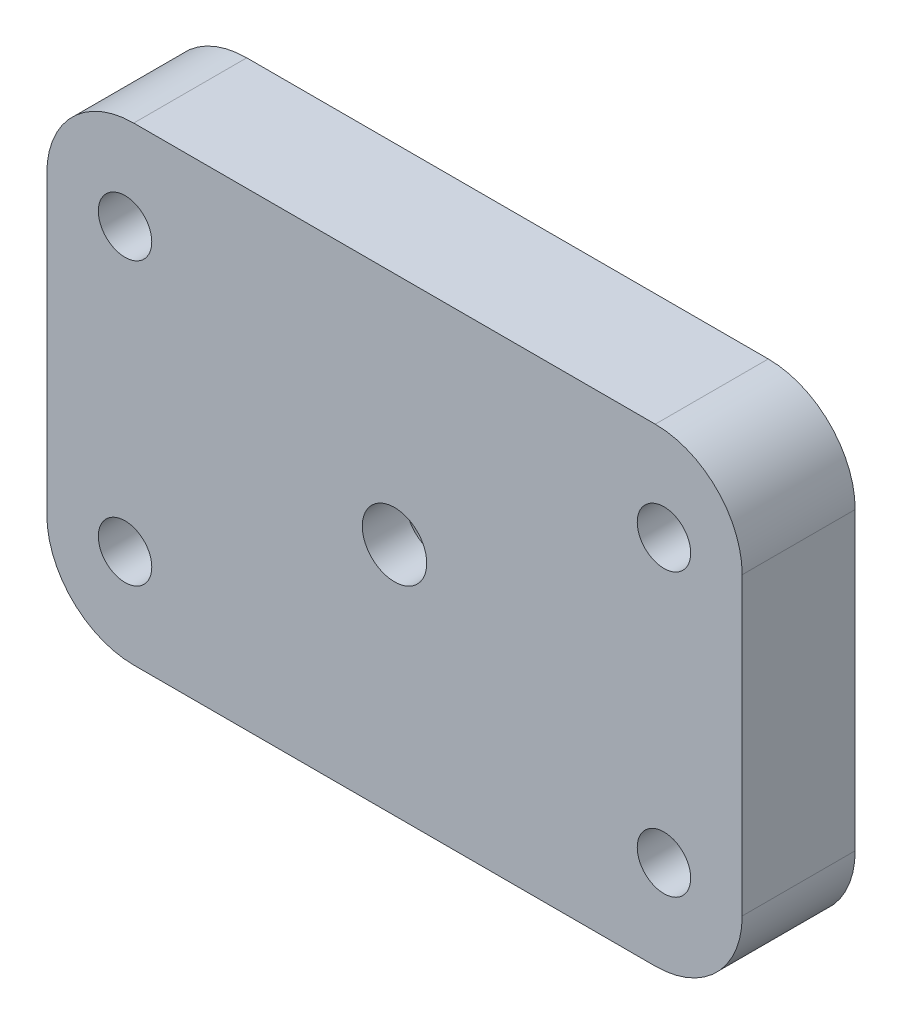
ISO-10303-21;
HEADER;
FILE_DESCRIPTION(('STEP AP214'),'2;1');
FILE_NAME('part.step','',(''),(''),'','','');
FILE_SCHEMA(('AUTOMOTIVE_DESIGN { 1 0 10303 214 1 1 1 1 }'));
ENDSEC;
DATA;
#1=APPLICATION_CONTEXT('core data for automotive mechanical design processes');
#2=APPLICATION_PROTOCOL_DEFINITION('international standard','automotive_design',2000,#1);
#3=PRODUCT_CONTEXT('',#1,'mechanical');
#4=PRODUCT('Part','Part','',(#3));
#5=PRODUCT_RELATED_PRODUCT_CATEGORY('part','',(#4));
#6=PRODUCT_DEFINITION_FORMATION('','',#4);
#7=PRODUCT_DEFINITION_CONTEXT('part definition',#1,'design');
#8=PRODUCT_DEFINITION('design','',#6,#7);
#9=PRODUCT_DEFINITION_SHAPE('','',#8);
#10=(LENGTH_UNIT() NAMED_UNIT(*) SI_UNIT(.MILLI.,.METRE.));
#11=(NAMED_UNIT(*) PLANE_ANGLE_UNIT() SI_UNIT($,.RADIAN.));
#12=(NAMED_UNIT(*) SI_UNIT($,.STERADIAN.) SOLID_ANGLE_UNIT());
#13=UNCERTAINTY_MEASURE_WITH_UNIT(LENGTH_MEASURE(1.E-05),#10,'distance_accuracy_value','');
#14=(GEOMETRIC_REPRESENTATION_CONTEXT(3) GLOBAL_UNCERTAINTY_ASSIGNED_CONTEXT((#13)) GLOBAL_UNIT_ASSIGNED_CONTEXT((#10,
#11,#12)) REPRESENTATION_CONTEXT('',''));
#15=CARTESIAN_POINT('',(0.,0.,0.));
#16=DIRECTION('',(0.,0.,1.));
#17=DIRECTION('',(1.,0.,0.));
#18=AXIS2_PLACEMENT_3D('',#15,#16,#17);
#19=CARTESIAN_POINT('',(0.,189.,39.));
#20=DIRECTION('',(0.,0.,1.));
#21=DIRECTION('',(1.,0.,0.));
#22=AXIS2_PLACEMENT_3D('',#19,#20,#21);
#23=PLANE('',#22);
#24=CARTESIAN_POINT('',(30.0000000000002,206.,39.));
#25=DIRECTION('',(0.,0.,1.));
#26=DIRECTION('',(1.,0.,0.));
#27=AXIS2_PLACEMENT_3D('',#24,#25,#26);
#28=CIRCLE('',#27,10.);
#29=CARTESIAN_POINT('',(30.0000000000002,216.,39.));
#30=VERTEX_POINT('',#29);
#31=CARTESIAN_POINT('',(40.0000000000002,206.,39.));
#32=VERTEX_POINT('',#31);
#33=EDGE_CURVE('E252',#30,#32,#28,.F.);
#34=ORIENTED_EDGE('',*,*,#33,.F.);
#35=DIRECTION('',(1.,0.,0.));
#36=VECTOR('',#35,1.);
#37=CARTESIAN_POINT('',(30.0000000000002,216.,39.));
#38=LINE('',#37,#36);
#39=CARTESIAN_POINT('',(-30.0000000000002,216.,39.));
#40=VERTEX_POINT('',#39);
#41=EDGE_CURVE('E249',#40,#30,#38,.T.);
#42=ORIENTED_EDGE('',*,*,#41,.F.);
#43=CARTESIAN_POINT('',(-30.0000000000002,206.,39.));
#44=DIRECTION('',(0.,0.,1.));
#45=DIRECTION('',(1.,0.,0.));
#46=AXIS2_PLACEMENT_3D('',#43,#44,#45);
#47=CIRCLE('',#46,10.);
#48=CARTESIAN_POINT('',(-40.0000000000002,206.,39.));
#49=VERTEX_POINT('',#48);
#50=EDGE_CURVE('E243',#49,#40,#47,.F.);
#51=ORIENTED_EDGE('',*,*,#50,.F.);
#52=DIRECTION('',(0.,1.,0.));
#53=VECTOR('',#52,1.);
#54=CARTESIAN_POINT('',(-40.0000000000002,206.,39.));
#55=LINE('',#54,#53);
#56=CARTESIAN_POINT('',(-40.0000000000002,172.,39.));
#57=VERTEX_POINT('',#56);
#58=EDGE_CURVE('E225',#57,#49,#55,.T.);
#59=ORIENTED_EDGE('',*,*,#58,.F.);
#60=CARTESIAN_POINT('',(-30.0000000000002,172.,39.));
#61=DIRECTION('',(0.,0.,1.));
#62=DIRECTION('',(1.,0.,0.));
#63=AXIS2_PLACEMENT_3D('',#60,#61,#62);
#64=CIRCLE('',#63,10.);
#65=CARTESIAN_POINT('',(-30.0000000000002,162.,39.));
#66=VERTEX_POINT('',#65);
#67=EDGE_CURVE('E109',#66,#57,#64,.F.);
#68=ORIENTED_EDGE('',*,*,#67,.F.);
#69=DIRECTION('',(1.,0.,0.));
#70=VECTOR('',#69,1.);
#71=CARTESIAN_POINT('',(-30.0000000000002,162.,39.));
#72=LINE('',#71,#70);
#73=CARTESIAN_POINT('',(30.0000000000002,162.,39.));
#74=VERTEX_POINT('',#73);
#75=EDGE_CURVE('E261',#74,#66,#72,.F.);
#76=ORIENTED_EDGE('',*,*,#75,.F.);
#77=CARTESIAN_POINT('',(30.0000000000002,172.,39.));
#78=DIRECTION('',(0.,0.,1.));
#79=DIRECTION('',(1.,0.,0.));
#80=AXIS2_PLACEMENT_3D('',#77,#78,#79);
#81=CIRCLE('',#80,10.);
#82=CARTESIAN_POINT('',(40.0000000000002,172.,39.));
#83=VERTEX_POINT('',#82);
#84=EDGE_CURVE('E258',#83,#74,#81,.F.);
#85=ORIENTED_EDGE('',*,*,#84,.F.);
#86=DIRECTION('',(0.,1.,0.));
#87=VECTOR('',#86,1.);
#88=CARTESIAN_POINT('',(40.0000000000002,172.,39.));
#89=LINE('',#88,#87);
#90=EDGE_CURVE('E255',#32,#83,#89,.F.);
#91=ORIENTED_EDGE('',*,*,#90,.F.);
#92=EDGE_LOOP('',(#34,#42,#51,#59,#68,#76,#85,#91));
#93=FACE_BOUND('',#92,.T.);
#94=CARTESIAN_POINT('',(0.,189.,39.));
#95=DIRECTION('',(0.,0.,1.));
#96=DIRECTION('',(1.,0.,0.));
#97=AXIS2_PLACEMENT_3D('',#94,#95,#96);
#98=CIRCLE('',#97,3.706733851603);
#99=CARTESIAN_POINT('',(3.70673385160301,189.,39.));
#100=VERTEX_POINT('',#99);
#101=EDGE_CURVE('E222',#100,#100,#98,.T.);
#102=ORIENTED_EDGE('',*,*,#101,.F.);
#103=EDGE_LOOP('',(#102));
#104=FACE_BOUND('',#103,.T.);
#105=CARTESIAN_POINT('',(30.9999999999999,172.8,39.));
#106=DIRECTION('',(0.,0.,1.));
#107=DIRECTION('',(1.,0.,0.));
#108=AXIS2_PLACEMENT_3D('',#105,#106,#107);
#109=CIRCLE('',#108,3.07500000000001);
#110=CARTESIAN_POINT('',(34.0749999999999,172.8,39.));
#111=VERTEX_POINT('',#110);
#112=EDGE_CURVE('E194',#111,#111,#109,.T.);
#113=ORIENTED_EDGE('',*,*,#112,.F.);
#114=EDGE_LOOP('',(#113));
#115=FACE_BOUND('',#114,.T.);
#116=CARTESIAN_POINT('',(30.9999999999998,205.2,39.));
#117=DIRECTION('',(0.,0.,1.));
#118=DIRECTION('',(1.,0.,0.));
#119=AXIS2_PLACEMENT_3D('',#116,#117,#118);
#120=CIRCLE('',#119,3.07500000000002);
#121=CARTESIAN_POINT('',(34.0749999999998,205.2,39.));
#122=VERTEX_POINT('',#121);
#123=EDGE_CURVE('E365',#122,#122,#120,.T.);
#124=ORIENTED_EDGE('',*,*,#123,.F.);
#125=EDGE_LOOP('',(#124));
#126=FACE_BOUND('',#125,.T.);
#127=CARTESIAN_POINT('',(-31.0000000000002,205.2,39.));
#128=DIRECTION('',(0.,0.,1.));
#129=DIRECTION('',(1.,0.,0.));
#130=AXIS2_PLACEMENT_3D('',#127,#128,#129);
#131=CIRCLE('',#130,3.07500000000001);
#132=CARTESIAN_POINT('',(-27.9250000000002,205.2,39.));
#133=VERTEX_POINT('',#132);
#134=EDGE_CURVE('E363',#133,#133,#131,.T.);
#135=ORIENTED_EDGE('',*,*,#134,.F.);
#136=EDGE_LOOP('',(#135));
#137=FACE_BOUND('',#136,.T.);
#138=CARTESIAN_POINT('',(-31.0000000000001,172.8,39.));
#139=DIRECTION('',(0.,0.,1.));
#140=DIRECTION('',(1.,0.,0.));
#141=AXIS2_PLACEMENT_3D('',#138,#139,#140);
#142=CIRCLE('',#141,3.07500000000001);
#143=CARTESIAN_POINT('',(-27.9250000000001,172.8,39.));
#144=VERTEX_POINT('',#143);
#145=EDGE_CURVE('E366',#144,#144,#142,.T.);
#146=ORIENTED_EDGE('',*,*,#145,.F.);
#147=EDGE_LOOP('',(#146));
#148=FACE_BOUND('',#147,.T.);
#149=ADVANCED_FACE('F33',(#93,#104,#115,#126,#137,#148),#23,.T.);
#150=CARTESIAN_POINT('',(-40.0000000000002,206.,26.));
#151=DIRECTION('',(-1.,0.,0.));
#152=DIRECTION('',(0.,0.,1.));
#153=AXIS2_PLACEMENT_3D('',#150,#151,#152);
#154=PLANE('',#153);
#155=ORIENTED_EDGE('',*,*,#58,.T.);
#156=DIRECTION('',(0.,0.,1.));
#157=VECTOR('',#156,1.);
#158=CARTESIAN_POINT('',(-40.0000000000002,206.,26.));
#159=LINE('',#158,#157);
#160=CARTESIAN_POINT('',(-40.0000000000002,206.,26.));
#161=VERTEX_POINT('',#160);
#162=EDGE_CURVE('E244',#161,#49,#159,.T.);
#163=ORIENTED_EDGE('',*,*,#162,.F.);
#164=DIRECTION('',(0.,1.,0.));
#165=VECTOR('',#164,1.);
#166=CARTESIAN_POINT('',(-40.0000000000002,189.,26.));
#167=LINE('',#166,#165);
#168=CARTESIAN_POINT('',(-40.0000000000002,172.,26.));
#169=VERTEX_POINT('',#168);
#170=EDGE_CURVE('E239',#161,#169,#167,.F.);
#171=ORIENTED_EDGE('',*,*,#170,.T.);
#172=DIRECTION('',(0.,0.,1.));
#173=VECTOR('',#172,1.);
#174=CARTESIAN_POINT('',(-40.0000000000002,172.,26.));
#175=LINE('',#174,#173);
#176=EDGE_CURVE('E262',#57,#169,#175,.F.);
#177=ORIENTED_EDGE('',*,*,#176,.F.);
#178=EDGE_LOOP('',(#155,#163,#171,#177));
#179=FACE_BOUND('',#178,.T.);
#180=ADVANCED_FACE('F307',(#179),#154,.T.);
#181=CARTESIAN_POINT('',(-30.0000000000002,172.,26.));
#182=DIRECTION('',(0.,0.,1.));
#183=DIRECTION('',(1.,0.,0.));
#184=AXIS2_PLACEMENT_3D('',#181,#182,#183);
#185=CYLINDRICAL_SURFACE('',#184,10.);
#186=ORIENTED_EDGE('',*,*,#67,.T.);
#187=ORIENTED_EDGE('',*,*,#176,.T.);
#188=CARTESIAN_POINT('',(-30.0000000000002,172.,26.));
#189=DIRECTION('',(0.,0.,1.));
#190=DIRECTION('',(1.,0.,0.));
#191=AXIS2_PLACEMENT_3D('',#188,#189,#190);
#192=CIRCLE('',#191,10.);
#193=CARTESIAN_POINT('',(-30.0000000000002,162.,26.));
#194=VERTEX_POINT('',#193);
#195=EDGE_CURVE('E238',#169,#194,#192,.T.);
#196=ORIENTED_EDGE('',*,*,#195,.T.);
#197=DIRECTION('',(0.,0.,-1.));
#198=VECTOR('',#197,1.);
#199=CARTESIAN_POINT('',(-30.0000000000002,162.,26.));
#200=LINE('',#199,#198);
#201=EDGE_CURVE('E259',#66,#194,#200,.T.);
#202=ORIENTED_EDGE('',*,*,#201,.F.);
#203=EDGE_LOOP('',(#186,#187,#196,#202));
#204=FACE_BOUND('',#203,.T.);
#205=ADVANCED_FACE('F304',(#204),#185,.T.);
#206=CARTESIAN_POINT('',(-30.0000000000002,162.,26.));
#207=DIRECTION('',(0.,-1.,0.));
#208=DIRECTION('',(0.,0.,-1.));
#209=AXIS2_PLACEMENT_3D('',#206,#207,#208);
#210=PLANE('',#209);
#211=ORIENTED_EDGE('',*,*,#75,.T.);
#212=ORIENTED_EDGE('',*,*,#201,.T.);
#213=DIRECTION('',(1.,0.,0.));
#214=VECTOR('',#213,1.);
#215=CARTESIAN_POINT('',(0.,162.,26.));
#216=LINE('',#215,#214);
#217=CARTESIAN_POINT('',(30.0000000000002,162.,26.));
#218=VERTEX_POINT('',#217);
#219=EDGE_CURVE('E235',#194,#218,#216,.T.);
#220=ORIENTED_EDGE('',*,*,#219,.T.);
#221=DIRECTION('',(0.,0.,1.));
#222=VECTOR('',#221,1.);
#223=CARTESIAN_POINT('',(30.0000000000002,162.,26.));
#224=LINE('',#223,#222);
#225=EDGE_CURVE('E256',#74,#218,#224,.F.);
#226=ORIENTED_EDGE('',*,*,#225,.F.);
#227=EDGE_LOOP('',(#211,#212,#220,#226));
#228=FACE_BOUND('',#227,.T.);
#229=ADVANCED_FACE('F297',(#228),#210,.T.);
#230=CARTESIAN_POINT('',(30.0000000000002,172.,26.));
#231=DIRECTION('',(0.,0.,1.));
#232=DIRECTION('',(1.,0.,0.));
#233=AXIS2_PLACEMENT_3D('',#230,#231,#232);
#234=CYLINDRICAL_SURFACE('',#233,10.);
#235=ORIENTED_EDGE('',*,*,#84,.T.);
#236=ORIENTED_EDGE('',*,*,#225,.T.);
#237=CARTESIAN_POINT('',(30.0000000000002,172.,26.));
#238=DIRECTION('',(0.,0.,1.));
#239=DIRECTION('',(1.,0.,0.));
#240=AXIS2_PLACEMENT_3D('',#237,#238,#239);
#241=CIRCLE('',#240,10.);
#242=CARTESIAN_POINT('',(40.0000000000002,172.,26.));
#243=VERTEX_POINT('',#242);
#244=EDGE_CURVE('E234',#218,#243,#241,.T.);
#245=ORIENTED_EDGE('',*,*,#244,.T.);
#246=DIRECTION('',(0.,0.,-1.));
#247=VECTOR('',#246,1.);
#248=CARTESIAN_POINT('',(40.0000000000002,172.,26.));
#249=LINE('',#248,#247);
#250=EDGE_CURVE('E253',#83,#243,#249,.T.);
#251=ORIENTED_EDGE('',*,*,#250,.F.);
#252=EDGE_LOOP('',(#235,#236,#245,#251));
#253=FACE_BOUND('',#252,.T.);
#254=ADVANCED_FACE('F289',(#253),#234,.T.);
#255=CARTESIAN_POINT('',(40.0000000000002,172.,26.));
#256=DIRECTION('',(1.,0.,0.));
#257=DIRECTION('',(0.,0.,-1.));
#258=AXIS2_PLACEMENT_3D('',#255,#256,#257);
#259=PLANE('',#258);
#260=ORIENTED_EDGE('',*,*,#90,.T.);
#261=ORIENTED_EDGE('',*,*,#250,.T.);
#262=DIRECTION('',(0.,1.,0.));
#263=VECTOR('',#262,1.);
#264=CARTESIAN_POINT('',(40.0000000000002,189.,26.));
#265=LINE('',#264,#263);
#266=CARTESIAN_POINT('',(40.0000000000002,206.,26.));
#267=VERTEX_POINT('',#266);
#268=EDGE_CURVE('E231',#243,#267,#265,.T.);
#269=ORIENTED_EDGE('',*,*,#268,.T.);
#270=DIRECTION('',(0.,0.,1.));
#271=VECTOR('',#270,1.);
#272=CARTESIAN_POINT('',(40.0000000000002,206.,26.));
#273=LINE('',#272,#271);
#274=EDGE_CURVE('E250',#32,#267,#273,.F.);
#275=ORIENTED_EDGE('',*,*,#274,.F.);
#276=EDGE_LOOP('',(#260,#261,#269,#275));
#277=FACE_BOUND('',#276,.T.);
#278=ADVANCED_FACE('F318',(#277),#259,.T.);
#279=CARTESIAN_POINT('',(30.0000000000002,206.,26.));
#280=DIRECTION('',(0.,0.,1.));
#281=DIRECTION('',(1.,0.,0.));
#282=AXIS2_PLACEMENT_3D('',#279,#280,#281);
#283=CYLINDRICAL_SURFACE('',#282,10.);
#284=ORIENTED_EDGE('',*,*,#33,.T.);
#285=ORIENTED_EDGE('',*,*,#274,.T.);
#286=CARTESIAN_POINT('',(30.0000000000002,206.,26.));
#287=DIRECTION('',(0.,0.,1.));
#288=DIRECTION('',(1.,0.,0.));
#289=AXIS2_PLACEMENT_3D('',#286,#287,#288);
#290=CIRCLE('',#289,10.);
#291=CARTESIAN_POINT('',(30.0000000000002,216.,26.));
#292=VERTEX_POINT('',#291);
#293=EDGE_CURVE('E230',#267,#292,#290,.T.);
#294=ORIENTED_EDGE('',*,*,#293,.T.);
#295=DIRECTION('',(0.,0.,1.));
#296=VECTOR('',#295,1.);
#297=CARTESIAN_POINT('',(30.0000000000002,216.,26.));
#298=LINE('',#297,#296);
#299=EDGE_CURVE('E247',#30,#292,#298,.F.);
#300=ORIENTED_EDGE('',*,*,#299,.F.);
#301=EDGE_LOOP('',(#284,#285,#294,#300));
#302=FACE_BOUND('',#301,.T.);
#303=ADVANCED_FACE('F315',(#302),#283,.T.);
#304=CARTESIAN_POINT('',(30.0000000000002,216.,26.));
#305=DIRECTION('',(0.,1.,0.));
#306=DIRECTION('',(0.,0.,1.));
#307=AXIS2_PLACEMENT_3D('',#304,#305,#306);
#308=PLANE('',#307);
#309=ORIENTED_EDGE('',*,*,#41,.T.);
#310=ORIENTED_EDGE('',*,*,#299,.T.);
#311=DIRECTION('',(1.,0.,0.));
#312=VECTOR('',#311,1.);
#313=CARTESIAN_POINT('',(0.,216.,26.));
#314=LINE('',#313,#312);
#315=CARTESIAN_POINT('',(-30.0000000000002,216.,26.));
#316=VERTEX_POINT('',#315);
#317=EDGE_CURVE('E226',#292,#316,#314,.F.);
#318=ORIENTED_EDGE('',*,*,#317,.T.);
#319=DIRECTION('',(0.,0.,1.));
#320=VECTOR('',#319,1.);
#321=CARTESIAN_POINT('',(-30.0000000000002,216.,26.));
#322=LINE('',#321,#320);
#323=EDGE_CURVE('E58',#40,#316,#322,.F.);
#324=ORIENTED_EDGE('',*,*,#323,.F.);
#325=EDGE_LOOP('',(#309,#310,#318,#324));
#326=FACE_BOUND('',#325,.T.);
#327=ADVANCED_FACE('F311',(#326),#308,.T.);
#328=CARTESIAN_POINT('',(-30.0000000000002,206.,26.));
#329=DIRECTION('',(0.,0.,1.));
#330=DIRECTION('',(1.,0.,0.));
#331=AXIS2_PLACEMENT_3D('',#328,#329,#330);
#332=CYLINDRICAL_SURFACE('',#331,10.);
#333=ORIENTED_EDGE('',*,*,#50,.T.);
#334=ORIENTED_EDGE('',*,*,#323,.T.);
#335=CARTESIAN_POINT('',(-30.0000000000002,206.,26.));
#336=DIRECTION('',(0.,0.,1.));
#337=DIRECTION('',(1.,0.,0.));
#338=AXIS2_PLACEMENT_3D('',#335,#336,#337);
#339=CIRCLE('',#338,10.);
#340=EDGE_CURVE('E229',#316,#161,#339,.T.);
#341=ORIENTED_EDGE('',*,*,#340,.T.);
#342=ORIENTED_EDGE('',*,*,#162,.T.);
#343=EDGE_LOOP('',(#333,#334,#341,#342));
#344=FACE_BOUND('',#343,.T.);
#345=ADVANCED_FACE('F320',(#344),#332,.T.);
#346=CARTESIAN_POINT('',(30.9999999999999,172.8,17.55));
#347=DIRECTION('',(0.,0.,-1.));
#348=DIRECTION('',(-1.,0.,0.));
#349=AXIS2_PLACEMENT_3D('',#346,#347,#348);
#350=CYLINDRICAL_SURFACE('',#349,3.075);
#351=CARTESIAN_POINT('',(30.9999999999999,172.8,26.));
#352=DIRECTION('',(0.,0.,-1.));
#353=DIRECTION('',(-1.,0.,0.));
#354=AXIS2_PLACEMENT_3D('',#351,#352,#353);
#355=CIRCLE('',#354,3.075);
#356=CARTESIAN_POINT('',(27.9249999999999,172.8,26.));
#357=VERTEX_POINT('',#356);
#358=EDGE_CURVE('E273',#357,#357,#355,.T.);
#359=ORIENTED_EDGE('',*,*,#358,.T.);
#360=EDGE_LOOP('',(#359));
#361=FACE_BOUND('',#360,.T.);
#362=ORIENTED_EDGE('',*,*,#112,.T.);
#363=EDGE_LOOP('',(#362));
#364=FACE_BOUND('',#363,.T.);
#365=ADVANCED_FACE('F322',(#361,#364),#350,.F.);
#366=CARTESIAN_POINT('',(-31.0000000000002,205.2,17.55));
#367=DIRECTION('',(0.,0.,-1.));
#368=DIRECTION('',(-1.,0.,0.));
#369=AXIS2_PLACEMENT_3D('',#366,#367,#368);
#370=CYLINDRICAL_SURFACE('',#369,3.075);
#371=CARTESIAN_POINT('',(-31.0000000000002,205.2,26.));
#372=DIRECTION('',(0.,0.,-1.));
#373=DIRECTION('',(-1.,0.,0.));
#374=AXIS2_PLACEMENT_3D('',#371,#372,#373);
#375=CIRCLE('',#374,3.075);
#376=CARTESIAN_POINT('',(-34.0750000000002,205.2,26.));
#377=VERTEX_POINT('',#376);
#378=EDGE_CURVE('E270',#377,#377,#375,.T.);
#379=ORIENTED_EDGE('',*,*,#378,.T.);
#380=EDGE_LOOP('',(#379));
#381=FACE_BOUND('',#380,.T.);
#382=ORIENTED_EDGE('',*,*,#134,.T.);
#383=EDGE_LOOP('',(#382));
#384=FACE_BOUND('',#383,.T.);
#385=ADVANCED_FACE('F329',(#381,#384),#370,.F.);
#386=CARTESIAN_POINT('',(-31.0000000000001,172.8,17.55));
#387=DIRECTION('',(0.,0.,-1.));
#388=DIRECTION('',(-1.,0.,0.));
#389=AXIS2_PLACEMENT_3D('',#386,#387,#388);
#390=CYLINDRICAL_SURFACE('',#389,3.075);
#391=CARTESIAN_POINT('',(-31.0000000000001,172.8,26.));
#392=DIRECTION('',(0.,0.,-1.));
#393=DIRECTION('',(-1.,0.,0.));
#394=AXIS2_PLACEMENT_3D('',#391,#392,#393);
#395=CIRCLE('',#394,3.075);
#396=CARTESIAN_POINT('',(-34.0750000000001,172.8,26.));
#397=VERTEX_POINT('',#396);
#398=EDGE_CURVE('E41',#397,#397,#395,.T.);
#399=ORIENTED_EDGE('',*,*,#398,.T.);
#400=EDGE_LOOP('',(#399));
#401=FACE_BOUND('',#400,.T.);
#402=ORIENTED_EDGE('',*,*,#145,.T.);
#403=EDGE_LOOP('',(#402));
#404=FACE_BOUND('',#403,.T.);
#405=ADVANCED_FACE('F345',(#401,#404),#390,.F.);
#406=CARTESIAN_POINT('',(30.9999999999998,205.2,17.55));
#407=DIRECTION('',(0.,0.,-1.));
#408=DIRECTION('',(-1.,0.,0.));
#409=AXIS2_PLACEMENT_3D('',#406,#407,#408);
#410=CYLINDRICAL_SURFACE('',#409,3.075);
#411=CARTESIAN_POINT('',(30.9999999999998,205.2,26.));
#412=DIRECTION('',(0.,0.,-1.));
#413=DIRECTION('',(-1.,0.,0.));
#414=AXIS2_PLACEMENT_3D('',#411,#412,#413);
#415=CIRCLE('',#414,3.075);
#416=CARTESIAN_POINT('',(27.9249999999998,205.2,26.));
#417=VERTEX_POINT('',#416);
#418=EDGE_CURVE('E11',#417,#417,#415,.T.);
#419=ORIENTED_EDGE('',*,*,#418,.T.);
#420=EDGE_LOOP('',(#419));
#421=FACE_BOUND('',#420,.T.);
#422=ORIENTED_EDGE('',*,*,#123,.T.);
#423=EDGE_LOOP('',(#422));
#424=FACE_BOUND('',#423,.T.);
#425=ADVANCED_FACE('F335',(#421,#424),#410,.F.);
#426=CARTESIAN_POINT('',(0.,189.,26.));
#427=DIRECTION('',(0.,0.,1.));
#428=DIRECTION('',(1.,0.,0.));
#429=AXIS2_PLACEMENT_3D('',#426,#427,#428);
#430=PLANE('',#429);
#431=DIRECTION('',(-1.,0.,0.));
#432=VECTOR('',#431,1.);
#433=CARTESIAN_POINT('',(-3.99999999999996,180.75,26.));
#434=LINE('',#433,#432);
#435=CARTESIAN_POINT('',(4.,180.75,26.));
#436=VERTEX_POINT('',#435);
#437=CARTESIAN_POINT('',(-3.99999999999996,180.75,26.));
#438=VERTEX_POINT('',#437);
#439=EDGE_CURVE('E193',#436,#438,#434,.T.);
#440=ORIENTED_EDGE('',*,*,#439,.F.);
#441=CARTESIAN_POINT('',(4.00000000000002,183.75,26.));
#442=DIRECTION('',(0.,0.,-1.));
#443=DIRECTION('',(1.,0.,0.));
#444=AXIS2_PLACEMENT_3D('',#441,#442,#443);
#445=CIRCLE('',#444,3.);
#446=CARTESIAN_POINT('',(7.00000000000002,183.75,26.));
#447=VERTEX_POINT('',#446);
#448=EDGE_CURVE('E49',#447,#436,#445,.T.);
#449=ORIENTED_EDGE('',*,*,#448,.F.);
#450=DIRECTION('',(0.,-1.,0.));
#451=VECTOR('',#450,1.);
#452=CARTESIAN_POINT('',(7.00000000000002,183.75,26.));
#453=LINE('',#452,#451);
#454=CARTESIAN_POINT('',(7.00000000000002,194.25,26.));
#455=VERTEX_POINT('',#454);
#456=EDGE_CURVE('E209',#455,#447,#453,.T.);
#457=ORIENTED_EDGE('',*,*,#456,.F.);
#458=CARTESIAN_POINT('',(4.00000000000002,194.25,26.));
#459=DIRECTION('',(0.,0.,-1.));
#460=DIRECTION('',(-1.,0.,0.));
#461=AXIS2_PLACEMENT_3D('',#458,#459,#460);
#462=CIRCLE('',#461,3.);
#463=CARTESIAN_POINT('',(4.,197.25,26.));
#464=VERTEX_POINT('',#463);
#465=EDGE_CURVE('E207',#464,#455,#462,.T.);
#466=ORIENTED_EDGE('',*,*,#465,.F.);
#467=DIRECTION('',(1.,0.,0.));
#468=VECTOR('',#467,1.);
#469=CARTESIAN_POINT('',(-3.99999999999996,197.25,26.));
#470=LINE('',#469,#468);
#471=CARTESIAN_POINT('',(-3.99999999999996,197.25,26.));
#472=VERTEX_POINT('',#471);
#473=EDGE_CURVE('E169',#472,#464,#470,.T.);
#474=ORIENTED_EDGE('',*,*,#473,.F.);
#475=CARTESIAN_POINT('',(-3.99999999999998,194.25,26.));
#476=DIRECTION('',(0.,0.,-1.));
#477=DIRECTION('',(-1.,0.,0.));
#478=AXIS2_PLACEMENT_3D('',#475,#476,#477);
#479=CIRCLE('',#478,3.);
#480=CARTESIAN_POINT('',(-6.99999999999998,194.25,26.));
#481=VERTEX_POINT('',#480);
#482=EDGE_CURVE('E203',#481,#472,#479,.T.);
#483=ORIENTED_EDGE('',*,*,#482,.F.);
#484=DIRECTION('',(0.,1.,0.));
#485=VECTOR('',#484,1.);
#486=CARTESIAN_POINT('',(-6.99999999999998,183.75,26.));
#487=LINE('',#486,#485);
#488=CARTESIAN_POINT('',(-6.99999999999998,183.75,26.));
#489=VERTEX_POINT('',#488);
#490=EDGE_CURVE('E200',#489,#481,#487,.T.);
#491=ORIENTED_EDGE('',*,*,#490,.F.);
#492=CARTESIAN_POINT('',(-3.99999999999998,183.75,26.));
#493=DIRECTION('',(0.,0.,-1.));
#494=DIRECTION('',(-1.,0.,0.));
#495=AXIS2_PLACEMENT_3D('',#492,#493,#494);
#496=CIRCLE('',#495,3.);
#497=EDGE_CURVE('E197',#438,#489,#496,.T.);
#498=ORIENTED_EDGE('',*,*,#497,.F.);
#499=EDGE_LOOP('',(#440,#449,#457,#466,#474,#483,#491,#498));
#500=FACE_BOUND('',#499,.T.);
#501=ORIENTED_EDGE('',*,*,#418,.F.);
#502=EDGE_LOOP('',(#501));
#503=FACE_BOUND('',#502,.T.);
#504=ORIENTED_EDGE('',*,*,#398,.F.);
#505=EDGE_LOOP('',(#504));
#506=FACE_BOUND('',#505,.T.);
#507=ORIENTED_EDGE('',*,*,#378,.F.);
#508=EDGE_LOOP('',(#507));
#509=FACE_BOUND('',#508,.T.);
#510=ORIENTED_EDGE('',*,*,#358,.F.);
#511=EDGE_LOOP('',(#510));
#512=FACE_BOUND('',#511,.T.);
#513=ORIENTED_EDGE('',*,*,#317,.F.);
#514=ORIENTED_EDGE('',*,*,#293,.F.);
#515=ORIENTED_EDGE('',*,*,#268,.F.);
#516=ORIENTED_EDGE('',*,*,#244,.F.);
#517=ORIENTED_EDGE('',*,*,#219,.F.);
#518=ORIENTED_EDGE('',*,*,#195,.F.);
#519=ORIENTED_EDGE('',*,*,#170,.F.);
#520=ORIENTED_EDGE('',*,*,#340,.F.);
#521=EDGE_LOOP('',(#513,#514,#515,#516,#517,#518,#519,#520));
#522=FACE_BOUND('',#521,.T.);
#523=ADVANCED_FACE('F302',(#500,#503,#506,#509,#512,#522),#430,.F.);
#524=CARTESIAN_POINT('',(0.,189.,111.124891681028));
#525=DIRECTION('',(0.,0.,-1.));
#526=DIRECTION('',(-1.,0.,0.));
#527=AXIS2_PLACEMENT_3D('',#524,#525,#526);
#528=CYLINDRICAL_SURFACE('',#527,3.706733851603);
#529=CARTESIAN_POINT('',(0.,189.,34.));
#530=DIRECTION('',(0.,0.,1.));
#531=DIRECTION('',(1.,0.,0.));
#532=AXIS2_PLACEMENT_3D('',#529,#530,#531);
#533=CIRCLE('',#532,3.706733851603);
#534=CARTESIAN_POINT('',(3.70673385160301,189.,34.));
#535=VERTEX_POINT('',#534);
#536=EDGE_CURVE('E36',#535,#535,#533,.T.);
#537=ORIENTED_EDGE('',*,*,#536,.F.);
#538=EDGE_LOOP('',(#537));
#539=FACE_BOUND('',#538,.T.);
#540=ORIENTED_EDGE('',*,*,#101,.T.);
#541=EDGE_LOOP('',(#540));
#542=FACE_BOUND('',#541,.T.);
#543=ADVANCED_FACE('F334',(#539,#542),#528,.F.);
#544=CARTESIAN_POINT('',(4.00000000000002,183.75,34.));
#545=DIRECTION('',(0.,0.,-1.));
#546=DIRECTION('',(-1.,0.,0.));
#547=AXIS2_PLACEMENT_3D('',#544,#545,#546);
#548=CYLINDRICAL_SURFACE('',#547,3.);
#549=ORIENTED_EDGE('',*,*,#448,.T.);
#550=DIRECTION('',(0.,0.,-1.));
#551=VECTOR('',#550,1.);
#552=CARTESIAN_POINT('',(4.,180.75,34.));
#553=LINE('',#552,#551);
#554=CARTESIAN_POINT('',(4.,180.75,34.));
#555=VERTEX_POINT('',#554);
#556=EDGE_CURVE('E145',#555,#436,#553,.T.);
#557=ORIENTED_EDGE('',*,*,#556,.F.);
#558=CARTESIAN_POINT('',(4.00000000000002,183.75,34.));
#559=DIRECTION('',(0.,0.,-1.));
#560=DIRECTION('',(1.,0.,0.));
#561=AXIS2_PLACEMENT_3D('',#558,#559,#560);
#562=CIRCLE('',#561,3.);
#563=CARTESIAN_POINT('',(7.00000000000002,183.75,34.));
#564=VERTEX_POINT('',#563);
#565=EDGE_CURVE('E211',#564,#555,#562,.T.);
#566=ORIENTED_EDGE('',*,*,#565,.F.);
#567=DIRECTION('',(0.,0.,-1.));
#568=VECTOR('',#567,1.);
#569=CARTESIAN_POINT('',(7.00000000000002,183.75,34.));
#570=LINE('',#569,#568);
#571=EDGE_CURVE('E117',#564,#447,#570,.T.);
#572=ORIENTED_EDGE('',*,*,#571,.T.);
#573=EDGE_LOOP('',(#549,#557,#566,#572));
#574=FACE_BOUND('',#573,.T.);
#575=ADVANCED_FACE('F341',(#574),#548,.F.);
#576=CARTESIAN_POINT('',(7.00000000000002,183.75,34.));
#577=DIRECTION('',(1.,0.,0.));
#578=DIRECTION('',(0.,0.,-1.));
#579=AXIS2_PLACEMENT_3D('',#576,#577,#578);
#580=PLANE('',#579);
#581=ORIENTED_EDGE('',*,*,#456,.T.);
#582=ORIENTED_EDGE('',*,*,#571,.F.);
#583=DIRECTION('',(0.,-1.,0.));
#584=VECTOR('',#583,1.);
#585=CARTESIAN_POINT('',(7.00000000000002,183.75,34.));
#586=LINE('',#585,#584);
#587=CARTESIAN_POINT('',(7.00000000000002,194.25,34.));
#588=VERTEX_POINT('',#587);
#589=EDGE_CURVE('E179',#588,#564,#586,.T.);
#590=ORIENTED_EDGE('',*,*,#589,.F.);
#591=DIRECTION('',(0.,0.,-1.));
#592=VECTOR('',#591,1.);
#593=CARTESIAN_POINT('',(7.00000000000002,194.25,34.));
#594=LINE('',#593,#592);
#595=EDGE_CURVE('E140',#588,#455,#594,.T.);
#596=ORIENTED_EDGE('',*,*,#595,.T.);
#597=EDGE_LOOP('',(#581,#582,#590,#596));
#598=FACE_BOUND('',#597,.T.);
#599=ADVANCED_FACE('F390',(#598),#580,.F.);
#600=CARTESIAN_POINT('',(4.00000000000002,194.25,34.));
#601=DIRECTION('',(0.,0.,-1.));
#602=DIRECTION('',(-1.,0.,0.));
#603=AXIS2_PLACEMENT_3D('',#600,#601,#602);
#604=CYLINDRICAL_SURFACE('',#603,3.);
#605=ORIENTED_EDGE('',*,*,#465,.T.);
#606=ORIENTED_EDGE('',*,*,#595,.F.);
#607=CARTESIAN_POINT('',(4.00000000000002,194.25,34.));
#608=DIRECTION('',(0.,0.,-1.));
#609=DIRECTION('',(-1.,0.,0.));
#610=AXIS2_PLACEMENT_3D('',#607,#608,#609);
#611=CIRCLE('',#610,3.);
#612=CARTESIAN_POINT('',(4.,197.25,34.));
#613=VERTEX_POINT('',#612);
#614=EDGE_CURVE('E175',#613,#588,#611,.T.);
#615=ORIENTED_EDGE('',*,*,#614,.F.);
#616=DIRECTION('',(0.,0.,-1.));
#617=VECTOR('',#616,1.);
#618=CARTESIAN_POINT('',(4.,197.25,34.));
#619=LINE('',#618,#617);
#620=EDGE_CURVE('E162',#613,#464,#619,.T.);
#621=ORIENTED_EDGE('',*,*,#620,.T.);
#622=EDGE_LOOP('',(#605,#606,#615,#621));
#623=FACE_BOUND('',#622,.T.);
#624=ADVANCED_FACE('F176',(#623),#604,.F.);
#625=CARTESIAN_POINT('',(-3.99999999999996,197.25,34.));
#626=DIRECTION('',(0.,1.,0.));
#627=DIRECTION('',(0.,0.,1.));
#628=AXIS2_PLACEMENT_3D('',#625,#626,#627);
#629=PLANE('',#628);
#630=ORIENTED_EDGE('',*,*,#473,.T.);
#631=ORIENTED_EDGE('',*,*,#620,.F.);
#632=DIRECTION('',(1.,0.,0.));
#633=VECTOR('',#632,1.);
#634=CARTESIAN_POINT('',(-3.99999999999996,197.25,34.));
#635=LINE('',#634,#633);
#636=CARTESIAN_POINT('',(-3.99999999999996,197.25,34.));
#637=VERTEX_POINT('',#636);
#638=EDGE_CURVE('E166',#637,#613,#635,.T.);
#639=ORIENTED_EDGE('',*,*,#638,.F.);
#640=DIRECTION('',(0.,0.,-1.));
#641=VECTOR('',#640,1.);
#642=CARTESIAN_POINT('',(-3.99999999999996,197.25,34.));
#643=LINE('',#642,#641);
#644=EDGE_CURVE('E172',#637,#472,#643,.T.);
#645=ORIENTED_EDGE('',*,*,#644,.T.);
#646=EDGE_LOOP('',(#630,#631,#639,#645));
#647=FACE_BOUND('',#646,.T.);
#648=ADVANCED_FACE('F164',(#647),#629,.F.);
#649=CARTESIAN_POINT('',(-3.99999999999998,194.25,34.));
#650=DIRECTION('',(0.,0.,-1.));
#651=DIRECTION('',(-1.,0.,0.));
#652=AXIS2_PLACEMENT_3D('',#649,#650,#651);
#653=CYLINDRICAL_SURFACE('',#652,3.);
#654=ORIENTED_EDGE('',*,*,#482,.T.);
#655=ORIENTED_EDGE('',*,*,#644,.F.);
#656=CARTESIAN_POINT('',(-3.99999999999998,194.25,34.));
#657=DIRECTION('',(0.,0.,-1.));
#658=DIRECTION('',(-1.,0.,0.));
#659=AXIS2_PLACEMENT_3D('',#656,#657,#658);
#660=CIRCLE('',#659,3.);
#661=CARTESIAN_POINT('',(-6.99999999999998,194.25,34.));
#662=VERTEX_POINT('',#661);
#663=EDGE_CURVE('E185',#662,#637,#660,.T.);
#664=ORIENTED_EDGE('',*,*,#663,.F.);
#665=DIRECTION('',(0.,0.,-1.));
#666=VECTOR('',#665,1.);
#667=CARTESIAN_POINT('',(-6.99999999999998,194.25,34.));
#668=LINE('',#667,#666);
#669=EDGE_CURVE('E215',#662,#481,#668,.T.);
#670=ORIENTED_EDGE('',*,*,#669,.T.);
#671=EDGE_LOOP('',(#654,#655,#664,#670));
#672=FACE_BOUND('',#671,.T.);
#673=ADVANCED_FACE('F388',(#672),#653,.F.);
#674=CARTESIAN_POINT('',(-6.99999999999998,183.75,34.));
#675=DIRECTION('',(-1.,0.,0.));
#676=DIRECTION('',(0.,0.,1.));
#677=AXIS2_PLACEMENT_3D('',#674,#675,#676);
#678=PLANE('',#677);
#679=ORIENTED_EDGE('',*,*,#490,.T.);
#680=ORIENTED_EDGE('',*,*,#669,.F.);
#681=DIRECTION('',(0.,1.,0.));
#682=VECTOR('',#681,1.);
#683=CARTESIAN_POINT('',(-6.99999999999998,183.75,34.));
#684=LINE('',#683,#682);
#685=CARTESIAN_POINT('',(-6.99999999999998,183.75,34.));
#686=VERTEX_POINT('',#685);
#687=EDGE_CURVE('E187',#686,#662,#684,.T.);
#688=ORIENTED_EDGE('',*,*,#687,.F.);
#689=DIRECTION('',(0.,0.,-1.));
#690=VECTOR('',#689,1.);
#691=CARTESIAN_POINT('',(-6.99999999999998,183.75,34.));
#692=LINE('',#691,#690);
#693=EDGE_CURVE('E217',#686,#489,#692,.T.);
#694=ORIENTED_EDGE('',*,*,#693,.T.);
#695=EDGE_LOOP('',(#679,#680,#688,#694));
#696=FACE_BOUND('',#695,.T.);
#697=ADVANCED_FACE('F384',(#696),#678,.F.);
#698=CARTESIAN_POINT('',(-3.99999999999998,183.75,34.));
#699=DIRECTION('',(0.,0.,-1.));
#700=DIRECTION('',(-1.,0.,0.));
#701=AXIS2_PLACEMENT_3D('',#698,#699,#700);
#702=CYLINDRICAL_SURFACE('',#701,3.);
#703=ORIENTED_EDGE('',*,*,#497,.T.);
#704=ORIENTED_EDGE('',*,*,#693,.F.);
#705=CARTESIAN_POINT('',(-3.99999999999998,183.75,34.));
#706=DIRECTION('',(0.,0.,-1.));
#707=DIRECTION('',(-1.,0.,0.));
#708=AXIS2_PLACEMENT_3D('',#705,#706,#707);
#709=CIRCLE('',#708,3.);
#710=CARTESIAN_POINT('',(-3.99999999999996,180.75,34.));
#711=VERTEX_POINT('',#710);
#712=EDGE_CURVE('E379',#711,#686,#709,.T.);
#713=ORIENTED_EDGE('',*,*,#712,.F.);
#714=DIRECTION('',(0.,0.,-1.));
#715=VECTOR('',#714,1.);
#716=CARTESIAN_POINT('',(-3.99999999999996,180.75,34.));
#717=LINE('',#716,#715);
#718=EDGE_CURVE('E219',#711,#438,#717,.T.);
#719=ORIENTED_EDGE('',*,*,#718,.T.);
#720=EDGE_LOOP('',(#703,#704,#713,#719));
#721=FACE_BOUND('',#720,.T.);
#722=ADVANCED_FACE('F406',(#721),#702,.F.);
#723=CARTESIAN_POINT('',(-3.99999999999996,180.75,34.));
#724=DIRECTION('',(0.,-1.,0.));
#725=DIRECTION('',(0.,0.,-1.));
#726=AXIS2_PLACEMENT_3D('',#723,#724,#725);
#727=PLANE('',#726);
#728=ORIENTED_EDGE('',*,*,#439,.T.);
#729=ORIENTED_EDGE('',*,*,#718,.F.);
#730=DIRECTION('',(-1.,0.,0.));
#731=VECTOR('',#730,1.);
#732=CARTESIAN_POINT('',(-3.99999999999996,180.75,34.));
#733=LINE('',#732,#731);
#734=EDGE_CURVE('E376',#555,#711,#733,.T.);
#735=ORIENTED_EDGE('',*,*,#734,.F.);
#736=ORIENTED_EDGE('',*,*,#556,.T.);
#737=EDGE_LOOP('',(#728,#729,#735,#736));
#738=FACE_BOUND('',#737,.T.);
#739=ADVANCED_FACE('F409',(#738),#727,.F.);
#740=CARTESIAN_POINT('',(4.00000000000002,183.75,34.));
#741=DIRECTION('',(0.,0.,1.));
#742=DIRECTION('',(1.,0.,0.));
#743=AXIS2_PLACEMENT_3D('',#740,#741,#742);
#744=PLANE('',#743);
#745=ORIENTED_EDGE('',*,*,#536,.T.);
#746=EDGE_LOOP('',(#745));
#747=FACE_BOUND('',#746,.T.);
#748=ORIENTED_EDGE('',*,*,#565,.T.);
#749=ORIENTED_EDGE('',*,*,#734,.T.);
#750=ORIENTED_EDGE('',*,*,#712,.T.);
#751=ORIENTED_EDGE('',*,*,#687,.T.);
#752=ORIENTED_EDGE('',*,*,#663,.T.);
#753=ORIENTED_EDGE('',*,*,#638,.T.);
#754=ORIENTED_EDGE('',*,*,#614,.T.);
#755=ORIENTED_EDGE('',*,*,#589,.T.);
#756=EDGE_LOOP('',(#748,#749,#750,#751,#752,#753,#754,#755));
#757=FACE_BOUND('',#756,.T.);
#758=ADVANCED_FACE('F182',(#747,#757),#744,.F.);
#759=CLOSED_SHELL('',(#149,#180,#205,#229,#254,#278,#303,#327,#345,#365,#385,#405,#425,#523,
#543,#575,#599,#624,#648,#673,#697,#722,#739,#758));
#760=MANIFOLD_SOLID_BREP('B2',#759);
#761=ADVANCED_BREP_SHAPE_REPRESENTATION('',(#18,#760),#14);
#762=SHAPE_DEFINITION_REPRESENTATION(#9,#761);
ENDSEC;
END-ISO-10303-21;
